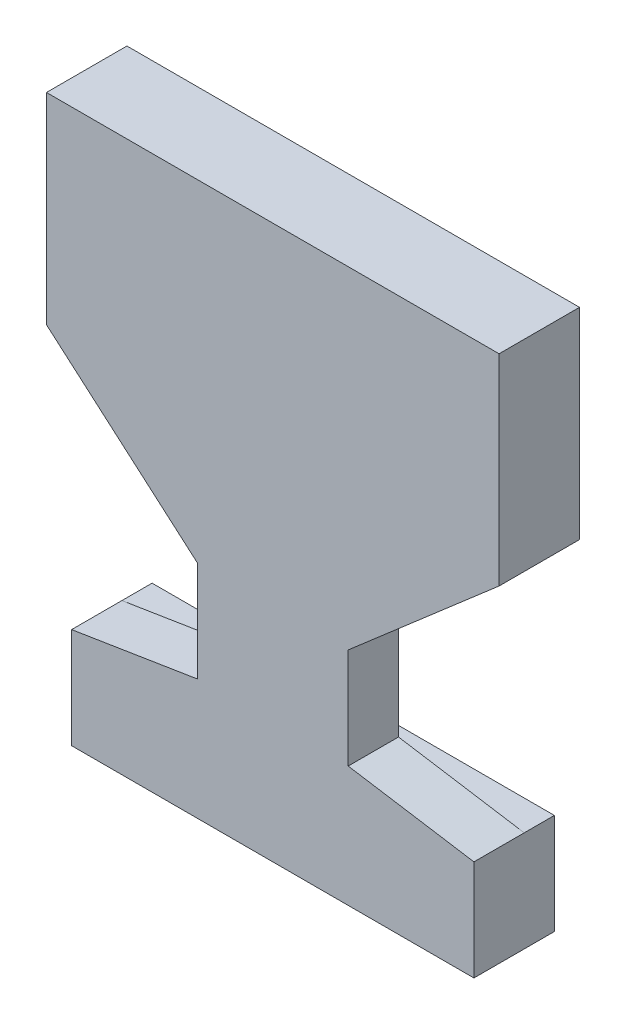
ISO-10303-21;
HEADER;
FILE_DESCRIPTION(('STEP AP214'),'2;1');
FILE_NAME('part.step','',(''),(''),'','','');
FILE_SCHEMA(('AUTOMOTIVE_DESIGN { 1 0 10303 214 1 1 1 1 }'));
ENDSEC;
DATA;
#1=APPLICATION_CONTEXT('core data for automotive mechanical design processes');
#2=APPLICATION_PROTOCOL_DEFINITION('international standard','automotive_design',2000,#1);
#3=PRODUCT_CONTEXT('',#1,'mechanical');
#4=PRODUCT('Part','Part','',(#3));
#5=PRODUCT_RELATED_PRODUCT_CATEGORY('part','',(#4));
#6=PRODUCT_DEFINITION_FORMATION('','',#4);
#7=PRODUCT_DEFINITION_CONTEXT('part definition',#1,'design');
#8=PRODUCT_DEFINITION('design','',#6,#7);
#9=PRODUCT_DEFINITION_SHAPE('','',#8);
#10=(LENGTH_UNIT() NAMED_UNIT(*) SI_UNIT(.MILLI.,.METRE.));
#11=(NAMED_UNIT(*) PLANE_ANGLE_UNIT() SI_UNIT($,.RADIAN.));
#12=(NAMED_UNIT(*) SI_UNIT($,.STERADIAN.) SOLID_ANGLE_UNIT());
#13=UNCERTAINTY_MEASURE_WITH_UNIT(LENGTH_MEASURE(1.E-05),#10,'distance_accuracy_value','');
#14=(GEOMETRIC_REPRESENTATION_CONTEXT(3) GLOBAL_UNCERTAINTY_ASSIGNED_CONTEXT((#13)) GLOBAL_UNIT_ASSIGNED_CONTEXT((#10,
#11,#12)) REPRESENTATION_CONTEXT('',''));
#15=CARTESIAN_POINT('',(0.,0.,0.));
#16=DIRECTION('',(0.,0.,1.));
#17=DIRECTION('',(1.,0.,0.));
#18=AXIS2_PLACEMENT_3D('',#15,#16,#17);
#19=CARTESIAN_POINT('',(0.,0.,0.));
#20=DIRECTION('',(0.,0.,1.));
#21=DIRECTION('',(1.,0.,0.));
#22=AXIS2_PLACEMENT_3D('',#19,#20,#21);
#23=PLANE('',#22);
#24=DIRECTION('',(0.,-1.,0.));
#25=VECTOR('',#24,1.);
#26=CARTESIAN_POINT('',(0.,10.,0.));
#27=LINE('',#26,#25);
#28=CARTESIAN_POINT('',(0.,10.,0.));
#29=VERTEX_POINT('',#28);
#30=CARTESIAN_POINT('',(0.,0.,0.));
#31=VERTEX_POINT('',#30);
#32=EDGE_CURVE('E148',#29,#31,#27,.T.);
#33=ORIENTED_EDGE('',*,*,#32,.F.);
#34=DIRECTION('',(-1.,0.,0.));
#35=VECTOR('',#34,1.);
#36=CARTESIAN_POINT('',(40.,10.,0.));
#37=LINE('',#36,#35);
#38=CARTESIAN_POINT('',(40.,10.,0.));
#39=VERTEX_POINT('',#38);
#40=EDGE_CURVE('E195',#39,#29,#37,.T.);
#41=ORIENTED_EDGE('',*,*,#40,.F.);
#42=DIRECTION('',(0.,1.,0.));
#43=VECTOR('',#42,1.);
#44=CARTESIAN_POINT('',(40.,0.,0.));
#45=LINE('',#44,#43);
#46=CARTESIAN_POINT('',(40.,0.,0.));
#47=VERTEX_POINT('',#46);
#48=EDGE_CURVE('E154',#47,#39,#45,.T.);
#49=ORIENTED_EDGE('',*,*,#48,.F.);
#50=DIRECTION('',(1.,0.,0.));
#51=VECTOR('',#50,1.);
#52=CARTESIAN_POINT('',(0.,0.,0.));
#53=LINE('',#52,#51);
#54=EDGE_CURVE('E151',#31,#47,#53,.T.);
#55=ORIENTED_EDGE('',*,*,#54,.F.);
#56=EDGE_LOOP('',(#33,#41,#49,#55));
#57=FACE_BOUND('',#56,.T.);
#58=ADVANCED_FACE('F35',(#57),#23,.F.);
#59=CARTESIAN_POINT('',(0.,10.,8.));
#60=DIRECTION('',(1.,0.,0.));
#61=DIRECTION('',(0.,1.,0.));
#62=AXIS2_PLACEMENT_3D('',#59,#60,#61);
#63=PLANE('',#62);
#64=ORIENTED_EDGE('',*,*,#32,.T.);
#65=DIRECTION('',(0.,0.,-1.));
#66=VECTOR('',#65,1.);
#67=CARTESIAN_POINT('',(0.,0.,8.));
#68=LINE('',#67,#66);
#69=CARTESIAN_POINT('',(0.,0.,8.));
#70=VERTEX_POINT('',#69);
#71=EDGE_CURVE('E11',#70,#31,#68,.T.);
#72=ORIENTED_EDGE('',*,*,#71,.F.);
#73=DIRECTION('',(0.,-1.,0.));
#74=VECTOR('',#73,1.);
#75=CARTESIAN_POINT('',(0.,10.,8.));
#76=LINE('',#75,#74);
#77=CARTESIAN_POINT('',(0.,10.,8.));
#78=VERTEX_POINT('',#77);
#79=EDGE_CURVE('E163',#78,#70,#76,.T.);
#80=ORIENTED_EDGE('',*,*,#79,.F.);
#81=DIRECTION('',(0.,0.,-1.));
#82=VECTOR('',#81,1.);
#83=CARTESIAN_POINT('',(0.,10.,8.));
#84=LINE('',#83,#82);
#85=CARTESIAN_POINT('',(0.,10.,3.));
#86=VERTEX_POINT('',#85);
#87=EDGE_CURVE('E144',#78,#86,#84,.T.);
#88=ORIENTED_EDGE('',*,*,#87,.T.);
#89=DIRECTION('',(0.,0.,-1.));
#90=VECTOR('',#89,1.);
#91=CARTESIAN_POINT('',(0.,10.,3.));
#92=LINE('',#91,#90);
#93=EDGE_CURVE('E216',#86,#29,#92,.T.);
#94=ORIENTED_EDGE('',*,*,#93,.T.);
#95=EDGE_LOOP('',(#64,#72,#80,#88,#94));
#96=FACE_BOUND('',#95,.T.);
#97=ADVANCED_FACE('F37',(#96),#63,.F.);
#98=CARTESIAN_POINT('',(0.,0.,8.));
#99=DIRECTION('',(0.,1.,0.));
#100=DIRECTION('',(0.,0.,1.));
#101=AXIS2_PLACEMENT_3D('',#98,#99,#100);
#102=PLANE('',#101);
#103=ORIENTED_EDGE('',*,*,#54,.T.);
#104=DIRECTION('',(0.,0.,-1.));
#105=VECTOR('',#104,1.);
#106=CARTESIAN_POINT('',(40.,0.,8.));
#107=LINE('',#106,#105);
#108=CARTESIAN_POINT('',(40.,0.,8.));
#109=VERTEX_POINT('',#108);
#110=EDGE_CURVE('E44',#109,#47,#107,.T.);
#111=ORIENTED_EDGE('',*,*,#110,.F.);
#112=DIRECTION('',(1.,0.,0.));
#113=VECTOR('',#112,1.);
#114=CARTESIAN_POINT('',(0.,0.,8.));
#115=LINE('',#114,#113);
#116=EDGE_CURVE('E89',#70,#109,#115,.T.);
#117=ORIENTED_EDGE('',*,*,#116,.F.);
#118=ORIENTED_EDGE('',*,*,#71,.T.);
#119=EDGE_LOOP('',(#103,#111,#117,#118));
#120=FACE_BOUND('',#119,.T.);
#121=ADVANCED_FACE('F279',(#120),#102,.F.);
#122=CARTESIAN_POINT('',(40.,0.,8.));
#123=DIRECTION('',(-1.,0.,0.));
#124=DIRECTION('',(0.,0.,1.));
#125=AXIS2_PLACEMENT_3D('',#122,#123,#124);
#126=PLANE('',#125);
#127=ORIENTED_EDGE('',*,*,#48,.T.);
#128=DIRECTION('',(0.,0.,-1.));
#129=VECTOR('',#128,1.);
#130=CARTESIAN_POINT('',(40.,10.,3.));
#131=LINE('',#130,#129);
#132=CARTESIAN_POINT('',(40.,10.,3.));
#133=VERTEX_POINT('',#132);
#134=EDGE_CURVE('E152',#133,#39,#131,.T.);
#135=ORIENTED_EDGE('',*,*,#134,.F.);
#136=DIRECTION('',(0.,0.,-1.));
#137=VECTOR('',#136,1.);
#138=CARTESIAN_POINT('',(40.,10.,8.));
#139=LINE('',#138,#137);
#140=CARTESIAN_POINT('',(40.,10.,8.));
#141=VERTEX_POINT('',#140);
#142=EDGE_CURVE('E181',#141,#133,#139,.T.);
#143=ORIENTED_EDGE('',*,*,#142,.F.);
#144=DIRECTION('',(0.,1.,0.));
#145=VECTOR('',#144,1.);
#146=CARTESIAN_POINT('',(40.,0.,8.));
#147=LINE('',#146,#145);
#148=EDGE_CURVE('E190',#109,#141,#147,.T.);
#149=ORIENTED_EDGE('',*,*,#148,.F.);
#150=ORIENTED_EDGE('',*,*,#110,.T.);
#151=EDGE_LOOP('',(#127,#135,#143,#149,#150));
#152=FACE_BOUND('',#151,.T.);
#153=ADVANCED_FACE('F187',(#152),#126,.F.);
#154=CARTESIAN_POINT('',(40.,10.,8.));
#155=DIRECTION('',(-0.157990501106673,-0.987440631916705,0.));
#156=DIRECTION('',(0.987440631916705,-0.157990501106673,0.));
#157=AXIS2_PLACEMENT_3D('',#154,#155,#156);
#158=PLANE('',#157);
#159=ORIENTED_EDGE('',*,*,#142,.T.);
#160=DIRECTION('',(0.987440631916705,-0.157990501106673,0.));
#161=VECTOR('',#160,1.);
#162=CARTESIAN_POINT('',(40.,10.,3.));
#163=LINE('',#162,#161);
#164=CARTESIAN_POINT('',(27.5,12.,3.));
#165=VERTEX_POINT('',#164);
#166=EDGE_CURVE('E208',#165,#133,#163,.T.);
#167=ORIENTED_EDGE('',*,*,#166,.F.);
#168=DIRECTION('',(0.,0.,-1.));
#169=VECTOR('',#168,1.);
#170=CARTESIAN_POINT('',(27.5,12.,8.));
#171=LINE('',#170,#169);
#172=CARTESIAN_POINT('',(27.5,12.,8.));
#173=VERTEX_POINT('',#172);
#174=EDGE_CURVE('E178',#173,#165,#171,.T.);
#175=ORIENTED_EDGE('',*,*,#174,.F.);
#176=DIRECTION('',(-0.987440631916705,0.157990501106673,0.));
#177=VECTOR('',#176,1.);
#178=CARTESIAN_POINT('',(40.,10.,8.));
#179=LINE('',#178,#177);
#180=EDGE_CURVE('E221',#141,#173,#179,.T.);
#181=ORIENTED_EDGE('',*,*,#180,.F.);
#182=EDGE_LOOP('',(#159,#167,#175,#181));
#183=FACE_BOUND('',#182,.T.);
#184=ADVANCED_FACE('F311',(#183),#158,.F.);
#185=CARTESIAN_POINT('',(27.5,12.,8.));
#186=DIRECTION('',(-1.,0.,0.));
#187=DIRECTION('',(0.,-1.,0.));
#188=AXIS2_PLACEMENT_3D('',#185,#186,#187);
#189=PLANE('',#188);
#190=ORIENTED_EDGE('',*,*,#174,.T.);
#191=DIRECTION('',(0.,-1.,0.));
#192=VECTOR('',#191,1.);
#193=CARTESIAN_POINT('',(27.5,12.,3.));
#194=LINE('',#193,#192);
#195=CARTESIAN_POINT('',(27.5,22.,3.));
#196=VERTEX_POINT('',#195);
#197=EDGE_CURVE('E304',#196,#165,#194,.T.);
#198=ORIENTED_EDGE('',*,*,#197,.F.);
#199=DIRECTION('',(0.,0.,-1.));
#200=VECTOR('',#199,1.);
#201=CARTESIAN_POINT('',(27.5,22.,8.));
#202=LINE('',#201,#200);
#203=CARTESIAN_POINT('',(27.5,22.,8.));
#204=VERTEX_POINT('',#203);
#205=EDGE_CURVE('E175',#204,#196,#202,.T.);
#206=ORIENTED_EDGE('',*,*,#205,.F.);
#207=DIRECTION('',(0.,1.,0.));
#208=VECTOR('',#207,1.);
#209=CARTESIAN_POINT('',(27.5,12.,8.));
#210=LINE('',#209,#208);
#211=EDGE_CURVE('E223',#173,#204,#210,.T.);
#212=ORIENTED_EDGE('',*,*,#211,.F.);
#213=EDGE_LOOP('',(#190,#198,#206,#212));
#214=FACE_BOUND('',#213,.T.);
#215=ADVANCED_FACE('F314',(#214),#189,.F.);
#216=CARTESIAN_POINT('',(27.5,22.,8.));
#217=DIRECTION('',(-0.654930538417842,0.755689082789818,0.));
#218=DIRECTION('',(-0.755689082789818,-0.654930538417842,0.));
#219=AXIS2_PLACEMENT_3D('',#216,#217,#218);
#220=PLANE('',#219);
#221=ORIENTED_EDGE('',*,*,#205,.T.);
#222=DIRECTION('',(-0.755689082789818,-0.654930538417842,0.));
#223=VECTOR('',#222,1.);
#224=CARTESIAN_POINT('',(27.5,22.,3.));
#225=LINE('',#224,#223);
#226=CARTESIAN_POINT('',(42.5,35.,3.));
#227=VERTEX_POINT('',#226);
#228=EDGE_CURVE('E303',#227,#196,#225,.T.);
#229=ORIENTED_EDGE('',*,*,#228,.F.);
#230=DIRECTION('',(0.,0.,-1.));
#231=VECTOR('',#230,1.);
#232=CARTESIAN_POINT('',(42.5,35.,8.));
#233=LINE('',#232,#231);
#234=CARTESIAN_POINT('',(42.5,35.,8.));
#235=VERTEX_POINT('',#234);
#236=EDGE_CURVE('E172',#235,#227,#233,.T.);
#237=ORIENTED_EDGE('',*,*,#236,.F.);
#238=DIRECTION('',(0.755689082789818,0.654930538417842,0.));
#239=VECTOR('',#238,1.);
#240=CARTESIAN_POINT('',(27.5,22.,8.));
#241=LINE('',#240,#239);
#242=EDGE_CURVE('E225',#204,#235,#241,.T.);
#243=ORIENTED_EDGE('',*,*,#242,.F.);
#244=EDGE_LOOP('',(#221,#229,#237,#243));
#245=FACE_BOUND('',#244,.T.);
#246=ADVANCED_FACE('F317',(#245),#220,.F.);
#247=CARTESIAN_POINT('',(42.5,35.,8.));
#248=DIRECTION('',(-1.,0.,0.));
#249=DIRECTION('',(0.,-1.,0.));
#250=AXIS2_PLACEMENT_3D('',#247,#248,#249);
#251=PLANE('',#250);
#252=DIRECTION('',(0.,1.,0.));
#253=VECTOR('',#252,1.);
#254=CARTESIAN_POINT('',(42.5,35.,0.));
#255=LINE('',#254,#253);
#256=CARTESIAN_POINT('',(42.5,35.,0.));
#257=VERTEX_POINT('',#256);
#258=CARTESIAN_POINT('',(42.5,55.,0.));
#259=VERTEX_POINT('',#258);
#260=EDGE_CURVE('E157',#257,#259,#255,.T.);
#261=ORIENTED_EDGE('',*,*,#260,.T.);
#262=DIRECTION('',(0.,0.,-1.));
#263=VECTOR('',#262,1.);
#264=CARTESIAN_POINT('',(42.5,55.,8.));
#265=LINE('',#264,#263);
#266=CARTESIAN_POINT('',(42.5,55.,8.));
#267=VERTEX_POINT('',#266);
#268=EDGE_CURVE('E170',#267,#259,#265,.T.);
#269=ORIENTED_EDGE('',*,*,#268,.F.);
#270=DIRECTION('',(0.,1.,0.));
#271=VECTOR('',#270,1.);
#272=CARTESIAN_POINT('',(42.5,35.,8.));
#273=LINE('',#272,#271);
#274=EDGE_CURVE('E227',#235,#267,#273,.T.);
#275=ORIENTED_EDGE('',*,*,#274,.F.);
#276=ORIENTED_EDGE('',*,*,#236,.T.);
#277=DIRECTION('',(0.,0.,-1.));
#278=VECTOR('',#277,1.);
#279=CARTESIAN_POINT('',(42.5,35.,3.));
#280=LINE('',#279,#278);
#281=EDGE_CURVE('E212',#227,#257,#280,.T.);
#282=ORIENTED_EDGE('',*,*,#281,.T.);
#283=EDGE_LOOP('',(#261,#269,#275,#276,#282));
#284=FACE_BOUND('',#283,.T.);
#285=ADVANCED_FACE('F261',(#284),#251,.F.);
#286=CARTESIAN_POINT('',(42.5,55.,8.));
#287=DIRECTION('',(0.,-1.,0.));
#288=DIRECTION('',(1.,0.,0.));
#289=AXIS2_PLACEMENT_3D('',#286,#287,#288);
#290=PLANE('',#289);
#291=DIRECTION('',(-1.,0.,0.));
#292=VECTOR('',#291,1.);
#293=CARTESIAN_POINT('',(42.5,55.,0.));
#294=LINE('',#293,#292);
#295=CARTESIAN_POINT('',(-2.5,55.,0.));
#296=VERTEX_POINT('',#295);
#297=EDGE_CURVE('E73',#259,#296,#294,.T.);
#298=ORIENTED_EDGE('',*,*,#297,.T.);
#299=DIRECTION('',(0.,0.,-1.));
#300=VECTOR('',#299,1.);
#301=CARTESIAN_POINT('',(-2.5,55.,8.));
#302=LINE('',#301,#300);
#303=CARTESIAN_POINT('',(-2.5,55.,8.));
#304=VERTEX_POINT('',#303);
#305=EDGE_CURVE('E168',#304,#296,#302,.T.);
#306=ORIENTED_EDGE('',*,*,#305,.F.);
#307=DIRECTION('',(-1.,0.,0.));
#308=VECTOR('',#307,1.);
#309=CARTESIAN_POINT('',(42.5,55.,8.));
#310=LINE('',#309,#308);
#311=EDGE_CURVE('E229',#267,#304,#310,.T.);
#312=ORIENTED_EDGE('',*,*,#311,.F.);
#313=ORIENTED_EDGE('',*,*,#268,.T.);
#314=EDGE_LOOP('',(#298,#306,#312,#313));
#315=FACE_BOUND('',#314,.T.);
#316=ADVANCED_FACE('F233',(#315),#290,.F.);
#317=CARTESIAN_POINT('',(-2.5,55.,8.));
#318=DIRECTION('',(1.,0.,0.));
#319=DIRECTION('',(0.,1.,0.));
#320=AXIS2_PLACEMENT_3D('',#317,#318,#319);
#321=PLANE('',#320);
#322=DIRECTION('',(0.,-1.,0.));
#323=VECTOR('',#322,1.);
#324=CARTESIAN_POINT('',(-2.5,55.,0.));
#325=LINE('',#324,#323);
#326=CARTESIAN_POINT('',(-2.49999999999999,35.,0.));
#327=VERTEX_POINT('',#326);
#328=EDGE_CURVE('E160',#296,#327,#325,.T.);
#329=ORIENTED_EDGE('',*,*,#328,.T.);
#330=DIRECTION('',(0.,0.,-1.));
#331=VECTOR('',#330,1.);
#332=CARTESIAN_POINT('',(-2.49999999999999,35.,3.));
#333=LINE('',#332,#331);
#334=CARTESIAN_POINT('',(-2.49999999999999,35.,3.));
#335=VERTEX_POINT('',#334);
#336=EDGE_CURVE('E81',#335,#327,#333,.T.);
#337=ORIENTED_EDGE('',*,*,#336,.F.);
#338=DIRECTION('',(0.,0.,-1.));
#339=VECTOR('',#338,1.);
#340=CARTESIAN_POINT('',(-2.49999999999999,35.,8.));
#341=LINE('',#340,#339);
#342=CARTESIAN_POINT('',(-2.49999999999999,35.,8.));
#343=VERTEX_POINT('',#342);
#344=EDGE_CURVE('E138',#343,#335,#341,.T.);
#345=ORIENTED_EDGE('',*,*,#344,.F.);
#346=DIRECTION('',(0.,-1.,0.));
#347=VECTOR('',#346,1.);
#348=CARTESIAN_POINT('',(-2.5,55.,8.));
#349=LINE('',#348,#347);
#350=EDGE_CURVE('E124',#304,#343,#349,.T.);
#351=ORIENTED_EDGE('',*,*,#350,.F.);
#352=ORIENTED_EDGE('',*,*,#305,.T.);
#353=EDGE_LOOP('',(#329,#337,#345,#351,#352));
#354=FACE_BOUND('',#353,.T.);
#355=ADVANCED_FACE('F236',(#354),#321,.F.);
#356=CARTESIAN_POINT('',(-2.49999999999999,35.,8.));
#357=DIRECTION('',(0.654930538417842,0.755689082789818,0.));
#358=DIRECTION('',(-0.755689082789818,0.654930538417842,0.));
#359=AXIS2_PLACEMENT_3D('',#356,#357,#358);
#360=PLANE('',#359);
#361=ORIENTED_EDGE('',*,*,#344,.T.);
#362=DIRECTION('',(-0.755689082789818,0.654930538417842,0.));
#363=VECTOR('',#362,1.);
#364=CARTESIAN_POINT('',(-2.49999999999999,35.,3.));
#365=LINE('',#364,#363);
#366=CARTESIAN_POINT('',(12.5,22.,3.));
#367=VERTEX_POINT('',#366);
#368=EDGE_CURVE('E135',#367,#335,#365,.T.);
#369=ORIENTED_EDGE('',*,*,#368,.F.);
#370=DIRECTION('',(0.,0.,-1.));
#371=VECTOR('',#370,1.);
#372=CARTESIAN_POINT('',(12.5,22.,8.));
#373=LINE('',#372,#371);
#374=CARTESIAN_POINT('',(12.5,22.,8.));
#375=VERTEX_POINT('',#374);
#376=EDGE_CURVE('E131',#375,#367,#373,.T.);
#377=ORIENTED_EDGE('',*,*,#376,.F.);
#378=DIRECTION('',(0.755689082789818,-0.654930538417842,0.));
#379=VECTOR('',#378,1.);
#380=CARTESIAN_POINT('',(-2.49999999999999,35.,8.));
#381=LINE('',#380,#379);
#382=EDGE_CURVE('E117',#343,#375,#381,.T.);
#383=ORIENTED_EDGE('',*,*,#382,.F.);
#384=EDGE_LOOP('',(#361,#369,#377,#383));
#385=FACE_BOUND('',#384,.T.);
#386=ADVANCED_FACE('F132',(#385),#360,.F.);
#387=CARTESIAN_POINT('',(12.5,22.,8.));
#388=DIRECTION('',(1.,0.,0.));
#389=DIRECTION('',(0.,0.,-1.));
#390=AXIS2_PLACEMENT_3D('',#387,#388,#389);
#391=PLANE('',#390);
#392=ORIENTED_EDGE('',*,*,#376,.T.);
#393=DIRECTION('',(0.,1.,0.));
#394=VECTOR('',#393,1.);
#395=CARTESIAN_POINT('',(12.5,22.,3.));
#396=LINE('',#395,#394);
#397=CARTESIAN_POINT('',(12.5,12.,3.));
#398=VERTEX_POINT('',#397);
#399=EDGE_CURVE('E297',#398,#367,#396,.T.);
#400=ORIENTED_EDGE('',*,*,#399,.F.);
#401=DIRECTION('',(0.,0.,-1.));
#402=VECTOR('',#401,1.);
#403=CARTESIAN_POINT('',(12.5,12.,8.));
#404=LINE('',#403,#402);
#405=CARTESIAN_POINT('',(12.5,12.,8.));
#406=VERTEX_POINT('',#405);
#407=EDGE_CURVE('E139',#406,#398,#404,.T.);
#408=ORIENTED_EDGE('',*,*,#407,.F.);
#409=DIRECTION('',(0.,-1.,0.));
#410=VECTOR('',#409,1.);
#411=CARTESIAN_POINT('',(12.5,22.,8.));
#412=LINE('',#411,#410);
#413=EDGE_CURVE('E121',#375,#406,#412,.T.);
#414=ORIENTED_EDGE('',*,*,#413,.F.);
#415=EDGE_LOOP('',(#392,#400,#408,#414));
#416=FACE_BOUND('',#415,.T.);
#417=ADVANCED_FACE('F141',(#416),#391,.F.);
#418=CARTESIAN_POINT('',(12.5,12.,8.));
#419=DIRECTION('',(0.157990501106673,-0.987440631916705,0.));
#420=DIRECTION('',(0.987440631916705,0.157990501106673,0.));
#421=AXIS2_PLACEMENT_3D('',#418,#419,#420);
#422=PLANE('',#421);
#423=ORIENTED_EDGE('',*,*,#407,.T.);
#424=DIRECTION('',(0.987440631916705,0.157990501106673,0.));
#425=VECTOR('',#424,1.);
#426=CARTESIAN_POINT('',(12.5,12.,3.));
#427=LINE('',#426,#425);
#428=EDGE_CURVE('E293',#86,#398,#427,.T.);
#429=ORIENTED_EDGE('',*,*,#428,.F.);
#430=ORIENTED_EDGE('',*,*,#87,.F.);
#431=DIRECTION('',(-0.987440631916705,-0.157990501106673,0.));
#432=VECTOR('',#431,1.);
#433=CARTESIAN_POINT('',(12.5,12.,8.));
#434=LINE('',#433,#432);
#435=EDGE_CURVE('E52',#406,#78,#434,.T.);
#436=ORIENTED_EDGE('',*,*,#435,.F.);
#437=EDGE_LOOP('',(#423,#429,#430,#436));
#438=FACE_BOUND('',#437,.T.);
#439=ADVANCED_FACE('F272',(#438),#422,.F.);
#440=CARTESIAN_POINT('',(0.,0.,8.));
#441=DIRECTION('',(0.,0.,1.));
#442=DIRECTION('',(1.,0.,0.));
#443=AXIS2_PLACEMENT_3D('',#440,#441,#442);
#444=PLANE('',#443);
#445=ORIENTED_EDGE('',*,*,#79,.T.);
#446=ORIENTED_EDGE('',*,*,#116,.T.);
#447=ORIENTED_EDGE('',*,*,#148,.T.);
#448=ORIENTED_EDGE('',*,*,#180,.T.);
#449=ORIENTED_EDGE('',*,*,#211,.T.);
#450=ORIENTED_EDGE('',*,*,#242,.T.);
#451=ORIENTED_EDGE('',*,*,#274,.T.);
#452=ORIENTED_EDGE('',*,*,#311,.T.);
#453=ORIENTED_EDGE('',*,*,#350,.T.);
#454=ORIENTED_EDGE('',*,*,#382,.T.);
#455=ORIENTED_EDGE('',*,*,#413,.T.);
#456=ORIENTED_EDGE('',*,*,#435,.T.);
#457=EDGE_LOOP('',(#445,#446,#447,#448,#449,#450,#451,#452,#453,#454,#455,#456));
#458=FACE_BOUND('',#457,.T.);
#459=ADVANCED_FACE('F119',(#458),#444,.T.);
#460=ORIENTED_EDGE('',*,*,#260,.F.);
#461=DIRECTION('',(1.,0.,0.));
#462=VECTOR('',#461,1.);
#463=CARTESIAN_POINT('',(42.5,35.,0.));
#464=LINE('',#463,#462);
#465=EDGE_CURVE('E203',#327,#257,#464,.T.);
#466=ORIENTED_EDGE('',*,*,#465,.F.);
#467=ORIENTED_EDGE('',*,*,#328,.F.);
#468=ORIENTED_EDGE('',*,*,#297,.F.);
#469=EDGE_LOOP('',(#460,#466,#467,#468));
#470=FACE_BOUND('',#469,.T.);
#471=ADVANCED_FACE('F263',(#470),#23,.F.);
#472=CARTESIAN_POINT('',(40.,10.,3.));
#473=DIRECTION('',(0.,-1.,0.));
#474=DIRECTION('',(1.,0.,0.));
#475=AXIS2_PLACEMENT_3D('',#472,#473,#474);
#476=PLANE('',#475);
#477=ORIENTED_EDGE('',*,*,#40,.T.);
#478=ORIENTED_EDGE('',*,*,#93,.F.);
#479=DIRECTION('',(-1.,0.,0.));
#480=VECTOR('',#479,1.);
#481=CARTESIAN_POINT('',(40.,10.,3.));
#482=LINE('',#481,#480);
#483=EDGE_CURVE('E205',#133,#86,#482,.T.);
#484=ORIENTED_EDGE('',*,*,#483,.F.);
#485=ORIENTED_EDGE('',*,*,#134,.T.);
#486=EDGE_LOOP('',(#477,#478,#484,#485));
#487=FACE_BOUND('',#486,.T.);
#488=ADVANCED_FACE('F265',(#487),#476,.F.);
#489=CARTESIAN_POINT('',(42.5,35.,3.));
#490=DIRECTION('',(0.,1.,0.));
#491=DIRECTION('',(-1.,0.,0.));
#492=AXIS2_PLACEMENT_3D('',#489,#490,#491);
#493=PLANE('',#492);
#494=ORIENTED_EDGE('',*,*,#465,.T.);
#495=ORIENTED_EDGE('',*,*,#281,.F.);
#496=DIRECTION('',(1.,0.,0.));
#497=VECTOR('',#496,1.);
#498=CARTESIAN_POINT('',(42.5,35.,3.));
#499=LINE('',#498,#497);
#500=EDGE_CURVE('E242',#335,#227,#499,.T.);
#501=ORIENTED_EDGE('',*,*,#500,.F.);
#502=ORIENTED_EDGE('',*,*,#336,.T.);
#503=EDGE_LOOP('',(#494,#495,#501,#502));
#504=FACE_BOUND('',#503,.T.);
#505=ADVANCED_FACE('F257',(#504),#493,.F.);
#506=CARTESIAN_POINT('',(0.,0.,3.));
#507=DIRECTION('',(0.,0.,1.));
#508=DIRECTION('',(1.,0.,0.));
#509=AXIS2_PLACEMENT_3D('',#506,#507,#508);
#510=PLANE('',#509);
#511=ORIENTED_EDGE('',*,*,#483,.T.);
#512=ORIENTED_EDGE('',*,*,#428,.T.);
#513=ORIENTED_EDGE('',*,*,#399,.T.);
#514=ORIENTED_EDGE('',*,*,#368,.T.);
#515=ORIENTED_EDGE('',*,*,#500,.T.);
#516=ORIENTED_EDGE('',*,*,#228,.T.);
#517=ORIENTED_EDGE('',*,*,#197,.T.);
#518=ORIENTED_EDGE('',*,*,#166,.T.);
#519=EDGE_LOOP('',(#511,#512,#513,#514,#515,#516,#517,#518));
#520=FACE_BOUND('',#519,.T.);
#521=ADVANCED_FACE('F292',(#520),#510,.F.);
#522=CLOSED_SHELL('',(#58,#97,#121,#153,#184,#215,#246,#285,#316,#355,#386,#417,#439,#459,#471,
#488,#505,#521));
#523=MANIFOLD_SOLID_BREP('B2',#522);
#524=ADVANCED_BREP_SHAPE_REPRESENTATION('',(#18,#523),#14);
#525=SHAPE_DEFINITION_REPRESENTATION(#9,#524);
ENDSEC;
END-ISO-10303-21;
